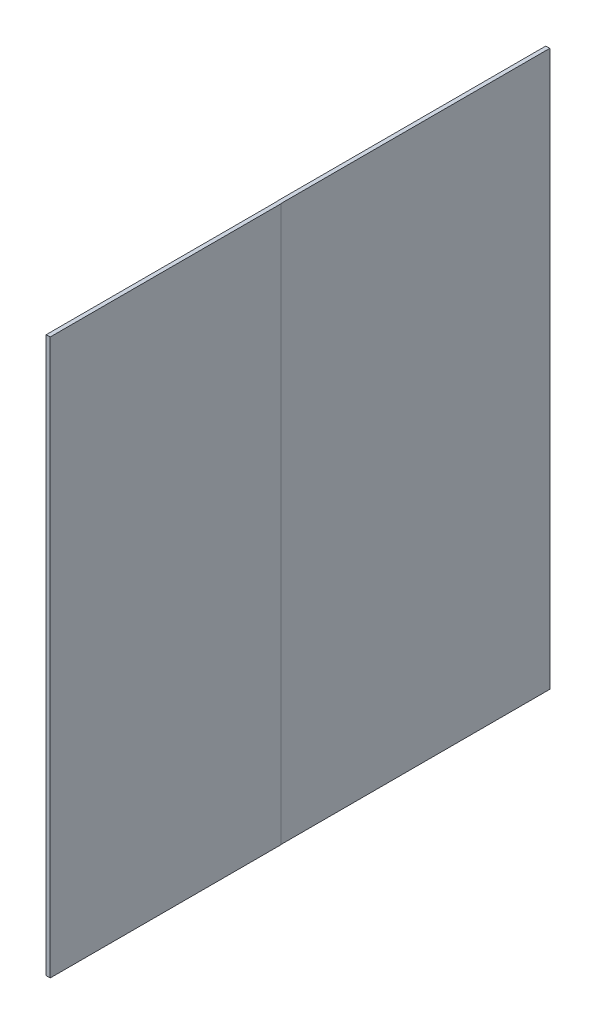
ISO-10303-21;
HEADER;
FILE_DESCRIPTION(('STEP AP214'),'2;1');
FILE_NAME('part.step','',(''),(''),'','','');
FILE_SCHEMA(('AUTOMOTIVE_DESIGN { 1 0 10303 214 1 1 1 1 }'));
ENDSEC;
DATA;
#1=APPLICATION_CONTEXT('core data for automotive mechanical design processes');
#2=APPLICATION_PROTOCOL_DEFINITION('international standard','automotive_design',2000,#1);
#3=PRODUCT_CONTEXT('',#1,'mechanical');
#4=PRODUCT('Part','Part','',(#3));
#5=PRODUCT_RELATED_PRODUCT_CATEGORY('part','',(#4));
#6=PRODUCT_DEFINITION_FORMATION('','',#4);
#7=PRODUCT_DEFINITION_CONTEXT('part definition',#1,'design');
#8=PRODUCT_DEFINITION('design','',#6,#7);
#9=PRODUCT_DEFINITION_SHAPE('','',#8);
#10=(LENGTH_UNIT() NAMED_UNIT(*) SI_UNIT(.MILLI.,.METRE.));
#11=(NAMED_UNIT(*) PLANE_ANGLE_UNIT() SI_UNIT($,.RADIAN.));
#12=(NAMED_UNIT(*) SI_UNIT($,.STERADIAN.) SOLID_ANGLE_UNIT());
#13=UNCERTAINTY_MEASURE_WITH_UNIT(LENGTH_MEASURE(1.E-05),#10,'distance_accuracy_value','');
#14=(GEOMETRIC_REPRESENTATION_CONTEXT(3) GLOBAL_UNCERTAINTY_ASSIGNED_CONTEXT((#13)) GLOBAL_UNIT_ASSIGNED_CONTEXT((#10,
#11,#12)) REPRESENTATION_CONTEXT('',''));
#15=CARTESIAN_POINT('',(0.,0.,0.));
#16=DIRECTION('',(0.,0.,1.));
#17=DIRECTION('',(1.,0.,0.));
#18=AXIS2_PLACEMENT_3D('',#15,#16,#17);
#19=CARTESIAN_POINT('',(-29.27,17.385,13.45));
#20=DIRECTION('',(0.,0.,-1.));
#21=DIRECTION('',(-1.,0.,0.));
#22=AXIS2_PLACEMENT_3D('',#19,#20,#21);
#23=PLANE('',#22);
#24=DIRECTION('',(0.,1.,0.));
#25=VECTOR('',#24,1.);
#26=CARTESIAN_POINT('',(-29.27,10.385,13.45));
#27=LINE('',#26,#25);
#28=CARTESIAN_POINT('',(-29.27,17.385,13.45));
#29=VERTEX_POINT('',#28);
#30=CARTESIAN_POINT('',(-29.27,-10.385,13.45));
#31=VERTEX_POINT('',#30);
#32=EDGE_CURVE('E116',#29,#31,#27,.F.);
#33=ORIENTED_EDGE('',*,*,#32,.T.);
#34=DIRECTION('',(-1.,0.,0.));
#35=VECTOR('',#34,1.);
#36=CARTESIAN_POINT('',(-29.27,-10.385,13.45));
#37=LINE('',#36,#35);
#38=CARTESIAN_POINT('',(-29.28,-10.385,13.45));
#39=VERTEX_POINT('',#38);
#40=EDGE_CURVE('E95',#31,#39,#37,.T.);
#41=ORIENTED_EDGE('',*,*,#40,.T.);
#42=DIRECTION('',(0.,1.,0.));
#43=VECTOR('',#42,1.);
#44=CARTESIAN_POINT('',(-29.28,10.385,13.45));
#45=LINE('',#44,#43);
#46=CARTESIAN_POINT('',(-29.28,17.385,13.45));
#47=VERTEX_POINT('',#46);
#48=EDGE_CURVE('E97',#39,#47,#45,.T.);
#49=ORIENTED_EDGE('',*,*,#48,.T.);
#50=DIRECTION('',(-1.,0.,0.));
#51=VECTOR('',#50,1.);
#52=CARTESIAN_POINT('',(-29.27,17.385,13.45));
#53=LINE('',#52,#51);
#54=EDGE_CURVE('E20',#47,#29,#53,.F.);
#55=ORIENTED_EDGE('',*,*,#54,.T.);
#56=EDGE_LOOP('',(#33,#41,#49,#55));
#57=FACE_BOUND('',#56,.T.);
#58=ADVANCED_FACE('F17',(#57),#23,.T.);
#59=CARTESIAN_POINT('',(-29.27,-10.385,25.));
#60=DIRECTION('',(0.,0.,1.));
#61=DIRECTION('',(1.,0.,0.));
#62=AXIS2_PLACEMENT_3D('',#59,#60,#61);
#63=PLANE('',#62);
#64=DIRECTION('',(0.,1.,0.));
#65=VECTOR('',#64,1.);
#66=CARTESIAN_POINT('',(-29.47,10.385,25.));
#67=LINE('',#66,#65);
#68=CARTESIAN_POINT('',(-29.47,-10.385,25.));
#69=VERTEX_POINT('',#68);
#70=CARTESIAN_POINT('',(-29.47,17.385,25.));
#71=VERTEX_POINT('',#70);
#72=EDGE_CURVE('E110',#69,#71,#67,.T.);
#73=ORIENTED_EDGE('',*,*,#72,.F.);
#74=DIRECTION('',(1.,0.,0.));
#75=VECTOR('',#74,1.);
#76=CARTESIAN_POINT('',(-29.27,-10.385,25.));
#77=LINE('',#76,#75);
#78=CARTESIAN_POINT('',(-29.27,-10.385,25.));
#79=VERTEX_POINT('',#78);
#80=EDGE_CURVE('E101',#69,#79,#77,.T.);
#81=ORIENTED_EDGE('',*,*,#80,.T.);
#82=DIRECTION('',(0.,1.,0.));
#83=VECTOR('',#82,1.);
#84=CARTESIAN_POINT('',(-29.27,10.385,25.));
#85=LINE('',#84,#83);
#86=CARTESIAN_POINT('',(-29.27,17.385,25.));
#87=VERTEX_POINT('',#86);
#88=EDGE_CURVE('E100',#79,#87,#85,.T.);
#89=ORIENTED_EDGE('',*,*,#88,.T.);
#90=DIRECTION('',(1.,0.,0.));
#91=VECTOR('',#90,1.);
#92=CARTESIAN_POINT('',(-29.27,17.385,25.));
#93=LINE('',#92,#91);
#94=EDGE_CURVE('E121',#87,#71,#93,.F.);
#95=ORIENTED_EDGE('',*,*,#94,.T.);
#96=EDGE_LOOP('',(#73,#81,#89,#95));
#97=FACE_BOUND('',#96,.T.);
#98=ADVANCED_FACE('F124',(#97),#63,.T.);
#99=CARTESIAN_POINT('',(-29.28,10.385,0.));
#100=DIRECTION('',(-1.,0.,0.));
#101=DIRECTION('',(0.,0.,1.));
#102=AXIS2_PLACEMENT_3D('',#99,#100,#101);
#103=PLANE('',#102);
#104=DIRECTION('',(0.,0.,-1.));
#105=VECTOR('',#104,1.);
#106=CARTESIAN_POINT('',(-29.28,-10.385,0.));
#107=LINE('',#106,#105);
#108=CARTESIAN_POINT('',(-29.28,-10.385,0.));
#109=VERTEX_POINT('',#108);
#110=EDGE_CURVE('E138',#109,#39,#107,.F.);
#111=ORIENTED_EDGE('',*,*,#110,.F.);
#112=DIRECTION('',(0.,1.,0.));
#113=VECTOR('',#112,1.);
#114=CARTESIAN_POINT('',(-29.28,17.385,0.));
#115=LINE('',#114,#113);
#116=CARTESIAN_POINT('',(-29.28,17.385,0.));
#117=VERTEX_POINT('',#116);
#118=EDGE_CURVE('E104',#117,#109,#115,.F.);
#119=ORIENTED_EDGE('',*,*,#118,.F.);
#120=DIRECTION('',(0.,0.,1.));
#121=VECTOR('',#120,1.);
#122=CARTESIAN_POINT('',(-29.28,17.385,13.45));
#123=LINE('',#122,#121);
#124=EDGE_CURVE('E88',#47,#117,#123,.F.);
#125=ORIENTED_EDGE('',*,*,#124,.F.);
#126=ORIENTED_EDGE('',*,*,#48,.F.);
#127=EDGE_LOOP('',(#111,#119,#125,#126));
#128=FACE_BOUND('',#127,.T.);
#129=ADVANCED_FACE('F103',(#128),#103,.F.);
#130=CARTESIAN_POINT('',(-29.27,10.385,11.55));
#131=DIRECTION('',(-1.,0.,0.));
#132=DIRECTION('',(0.,0.,1.));
#133=AXIS2_PLACEMENT_3D('',#130,#131,#132);
#134=PLANE('',#133);
#135=DIRECTION('',(0.,0.,1.));
#136=VECTOR('',#135,1.);
#137=CARTESIAN_POINT('',(-29.27,17.385,13.45));
#138=LINE('',#137,#136);
#139=EDGE_CURVE('E91',#87,#29,#138,.F.);
#140=ORIENTED_EDGE('',*,*,#139,.F.);
#141=ORIENTED_EDGE('',*,*,#88,.F.);
#142=DIRECTION('',(0.,0.,-1.));
#143=VECTOR('',#142,1.);
#144=CARTESIAN_POINT('',(-29.27,-10.385,0.));
#145=LINE('',#144,#143);
#146=EDGE_CURVE('E140',#31,#79,#145,.F.);
#147=ORIENTED_EDGE('',*,*,#146,.F.);
#148=ORIENTED_EDGE('',*,*,#32,.F.);
#149=EDGE_LOOP('',(#140,#141,#147,#148));
#150=FACE_BOUND('',#149,.T.);
#151=ADVANCED_FACE('F163',(#150),#134,.F.);
#152=CARTESIAN_POINT('',(-29.47,10.385,11.55));
#153=DIRECTION('',(-1.,0.,0.));
#154=DIRECTION('',(0.,0.,1.));
#155=AXIS2_PLACEMENT_3D('',#152,#153,#154);
#156=PLANE('',#155);
#157=ORIENTED_EDGE('',*,*,#72,.T.);
#158=DIRECTION('',(0.,0.,1.));
#159=VECTOR('',#158,1.);
#160=CARTESIAN_POINT('',(-29.47,17.385,13.45));
#161=LINE('',#160,#159);
#162=CARTESIAN_POINT('',(-29.47,17.385,13.45));
#163=VERTEX_POINT('',#162);
#164=EDGE_CURVE('E108',#163,#71,#161,.T.);
#165=ORIENTED_EDGE('',*,*,#164,.F.);
#166=DIRECTION('',(0.,1.,0.));
#167=VECTOR('',#166,1.);
#168=CARTESIAN_POINT('',(-29.47,-10.385,13.45));
#169=LINE('',#168,#167);
#170=CARTESIAN_POINT('',(-29.47,-10.385,13.45));
#171=VERTEX_POINT('',#170);
#172=EDGE_CURVE('E79',#171,#163,#169,.T.);
#173=ORIENTED_EDGE('',*,*,#172,.F.);
#174=DIRECTION('',(0.,0.,-1.));
#175=VECTOR('',#174,1.);
#176=CARTESIAN_POINT('',(-29.47,-10.385,0.));
#177=LINE('',#176,#175);
#178=EDGE_CURVE('E131',#69,#171,#177,.T.);
#179=ORIENTED_EDGE('',*,*,#178,.F.);
#180=EDGE_LOOP('',(#157,#165,#173,#179));
#181=FACE_BOUND('',#180,.T.);
#182=ADVANCED_FACE('F129',(#181),#156,.T.);
#183=CARTESIAN_POINT('',(-29.28,-10.385,13.45));
#184=DIRECTION('',(0.,0.,1.));
#185=DIRECTION('',(1.,0.,0.));
#186=AXIS2_PLACEMENT_3D('',#183,#184,#185);
#187=PLANE('',#186);
#188=DIRECTION('',(0.,1.,0.));
#189=VECTOR('',#188,1.);
#190=CARTESIAN_POINT('',(-29.48,10.385,13.45));
#191=LINE('',#190,#189);
#192=CARTESIAN_POINT('',(-29.48,-10.385,13.45));
#193=VERTEX_POINT('',#192);
#194=CARTESIAN_POINT('',(-29.48,17.385,13.45));
#195=VERTEX_POINT('',#194);
#196=EDGE_CURVE('E148',#193,#195,#191,.T.);
#197=ORIENTED_EDGE('',*,*,#196,.F.);
#198=DIRECTION('',(1.,0.,0.));
#199=VECTOR('',#198,1.);
#200=CARTESIAN_POINT('',(-29.28,-10.385,13.45));
#201=LINE('',#200,#199);
#202=EDGE_CURVE('E144',#171,#193,#201,.F.);
#203=ORIENTED_EDGE('',*,*,#202,.F.);
#204=ORIENTED_EDGE('',*,*,#172,.T.);
#205=DIRECTION('',(1.,0.,0.));
#206=VECTOR('',#205,1.);
#207=CARTESIAN_POINT('',(-29.28,17.385,13.45));
#208=LINE('',#207,#206);
#209=EDGE_CURVE('E105',#195,#163,#208,.T.);
#210=ORIENTED_EDGE('',*,*,#209,.F.);
#211=EDGE_LOOP('',(#197,#203,#204,#210));
#212=FACE_BOUND('',#211,.T.);
#213=ADVANCED_FACE('F158',(#212),#187,.T.);
#214=CARTESIAN_POINT('',(-29.28,17.385,13.45));
#215=DIRECTION('',(0.,1.,0.));
#216=DIRECTION('',(0.,0.,1.));
#217=AXIS2_PLACEMENT_3D('',#214,#215,#216);
#218=PLANE('',#217);
#219=ORIENTED_EDGE('',*,*,#139,.T.);
#220=ORIENTED_EDGE('',*,*,#54,.F.);
#221=ORIENTED_EDGE('',*,*,#124,.T.);
#222=DIRECTION('',(-1.,0.,0.));
#223=VECTOR('',#222,1.);
#224=CARTESIAN_POINT('',(-29.28,17.385,0.));
#225=LINE('',#224,#223);
#226=CARTESIAN_POINT('',(-29.48,17.385,0.));
#227=VERTEX_POINT('',#226);
#228=EDGE_CURVE('E136',#227,#117,#225,.F.);
#229=ORIENTED_EDGE('',*,*,#228,.F.);
#230=DIRECTION('',(0.,0.,1.));
#231=VECTOR('',#230,1.);
#232=CARTESIAN_POINT('',(-29.48,17.385,0.));
#233=LINE('',#232,#231);
#234=EDGE_CURVE('E151',#195,#227,#233,.F.);
#235=ORIENTED_EDGE('',*,*,#234,.F.);
#236=ORIENTED_EDGE('',*,*,#209,.T.);
#237=ORIENTED_EDGE('',*,*,#164,.T.);
#238=ORIENTED_EDGE('',*,*,#94,.F.);
#239=EDGE_LOOP('',(#219,#220,#221,#229,#235,#236,#237,#238));
#240=FACE_BOUND('',#239,.T.);
#241=ADVANCED_FACE('F86',(#240),#218,.T.);
#242=CARTESIAN_POINT('',(-29.28,17.385,0.));
#243=DIRECTION('',(0.,0.,-1.));
#244=DIRECTION('',(-1.,0.,0.));
#245=AXIS2_PLACEMENT_3D('',#242,#243,#244);
#246=PLANE('',#245);
#247=DIRECTION('',(0.,1.,0.));
#248=VECTOR('',#247,1.);
#249=CARTESIAN_POINT('',(-29.48,10.385,0.));
#250=LINE('',#249,#248);
#251=CARTESIAN_POINT('',(-29.48,-10.385,0.));
#252=VERTEX_POINT('',#251);
#253=EDGE_CURVE('E26',#227,#252,#250,.F.);
#254=ORIENTED_EDGE('',*,*,#253,.F.);
#255=ORIENTED_EDGE('',*,*,#228,.T.);
#256=ORIENTED_EDGE('',*,*,#118,.T.);
#257=DIRECTION('',(1.,0.,0.));
#258=VECTOR('',#257,1.);
#259=CARTESIAN_POINT('',(-29.28,-10.385,0.));
#260=LINE('',#259,#258);
#261=EDGE_CURVE('E35',#252,#109,#260,.T.);
#262=ORIENTED_EDGE('',*,*,#261,.F.);
#263=EDGE_LOOP('',(#254,#255,#256,#262));
#264=FACE_BOUND('',#263,.T.);
#265=ADVANCED_FACE('F157',(#264),#246,.T.);
#266=CARTESIAN_POINT('',(-29.28,-10.385,0.));
#267=DIRECTION('',(0.,-1.,0.));
#268=DIRECTION('',(0.,0.,-1.));
#269=AXIS2_PLACEMENT_3D('',#266,#267,#268);
#270=PLANE('',#269);
#271=DIRECTION('',(0.,0.,1.));
#272=VECTOR('',#271,1.);
#273=CARTESIAN_POINT('',(-29.48,-10.385,0.));
#274=LINE('',#273,#272);
#275=EDGE_CURVE('E11',#252,#193,#274,.T.);
#276=ORIENTED_EDGE('',*,*,#275,.F.);
#277=ORIENTED_EDGE('',*,*,#261,.T.);
#278=ORIENTED_EDGE('',*,*,#110,.T.);
#279=ORIENTED_EDGE('',*,*,#40,.F.);
#280=ORIENTED_EDGE('',*,*,#146,.T.);
#281=ORIENTED_EDGE('',*,*,#80,.F.);
#282=ORIENTED_EDGE('',*,*,#178,.T.);
#283=ORIENTED_EDGE('',*,*,#202,.T.);
#284=EDGE_LOOP('',(#276,#277,#278,#279,#280,#281,#282,#283));
#285=FACE_BOUND('',#284,.T.);
#286=ADVANCED_FACE('F160',(#285),#270,.T.);
#287=CARTESIAN_POINT('',(-29.48,10.385,0.));
#288=DIRECTION('',(-1.,0.,0.));
#289=DIRECTION('',(0.,0.,1.));
#290=AXIS2_PLACEMENT_3D('',#287,#288,#289);
#291=PLANE('',#290);
#292=ORIENTED_EDGE('',*,*,#253,.T.);
#293=ORIENTED_EDGE('',*,*,#275,.T.);
#294=ORIENTED_EDGE('',*,*,#196,.T.);
#295=ORIENTED_EDGE('',*,*,#234,.T.);
#296=EDGE_LOOP('',(#292,#293,#294,#295));
#297=FACE_BOUND('',#296,.T.);
#298=ADVANCED_FACE('F156',(#297),#291,.T.);
#299=CLOSED_SHELL('',(#58,#98,#129,#151,#182,#213,#241,#265,#286,#298));
#300=MANIFOLD_SOLID_BREP('B1',#299);
#301=ADVANCED_BREP_SHAPE_REPRESENTATION('',(#18,#300),#14);
#302=SHAPE_DEFINITION_REPRESENTATION(#9,#301);
ENDSEC;
END-ISO-10303-21;
